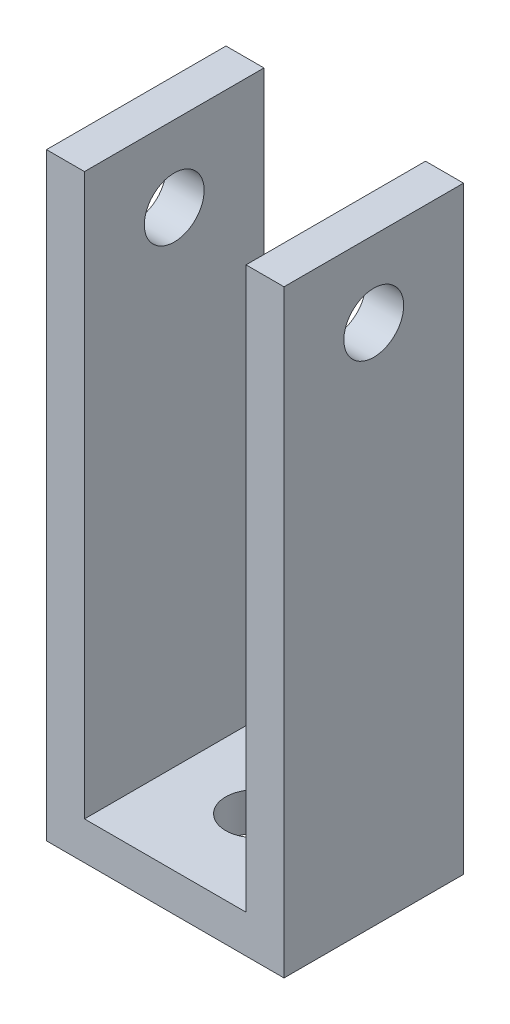
ISO-10303-21;
HEADER;
FILE_DESCRIPTION(('STEP AP214'),'2;1');
FILE_NAME('part.step','',(''),(''),'','','');
FILE_SCHEMA(('AUTOMOTIVE_DESIGN { 1 0 10303 214 1 1 1 1 }'));
ENDSEC;
DATA;
#1=APPLICATION_CONTEXT('core data for automotive mechanical design processes');
#2=APPLICATION_PROTOCOL_DEFINITION('international standard','automotive_design',2000,#1);
#3=PRODUCT_CONTEXT('',#1,'mechanical');
#4=PRODUCT('Part','Part','',(#3));
#5=PRODUCT_RELATED_PRODUCT_CATEGORY('part','',(#4));
#6=PRODUCT_DEFINITION_FORMATION('','',#4);
#7=PRODUCT_DEFINITION_CONTEXT('part definition',#1,'design');
#8=PRODUCT_DEFINITION('design','',#6,#7);
#9=PRODUCT_DEFINITION_SHAPE('','',#8);
#10=(LENGTH_UNIT() NAMED_UNIT(*) SI_UNIT(.MILLI.,.METRE.));
#11=(NAMED_UNIT(*) PLANE_ANGLE_UNIT() SI_UNIT($,.RADIAN.));
#12=(NAMED_UNIT(*) SI_UNIT($,.STERADIAN.) SOLID_ANGLE_UNIT());
#13=UNCERTAINTY_MEASURE_WITH_UNIT(LENGTH_MEASURE(1.E-05),#10,'distance_accuracy_value','');
#14=(GEOMETRIC_REPRESENTATION_CONTEXT(3) GLOBAL_UNCERTAINTY_ASSIGNED_CONTEXT((#13)) GLOBAL_UNIT_ASSIGNED_CONTEXT((#10,
#11,#12)) REPRESENTATION_CONTEXT('',''));
#15=CARTESIAN_POINT('',(0.,0.,0.));
#16=DIRECTION('',(0.,0.,1.));
#17=DIRECTION('',(1.,0.,0.));
#18=AXIS2_PLACEMENT_3D('',#15,#16,#17);
#19=CARTESIAN_POINT('',(0.,-81.,15.));
#20=DIRECTION('',(0.,-1.,0.));
#21=DIRECTION('',(0.,0.,-1.));
#22=AXIS2_PLACEMENT_3D('',#19,#20,#21);
#23=PLANE('',#22);
#24=CARTESIAN_POINT('',(1.13259527701055E-13,-81.,0.));
#25=DIRECTION('',(0.,-1.,0.));
#26=DIRECTION('',(0.,0.,-1.));
#27=AXIS2_PLACEMENT_3D('',#24,#25,#26);
#28=CIRCLE('',#27,4.89999999999988);
#29=CARTESIAN_POINT('',(4.9,-81.,0.));
#30=VERTEX_POINT('',#29);
#31=EDGE_CURVE('E224',#30,#30,#28,.T.);
#32=ORIENTED_EDGE('',*,*,#31,.T.);
#33=EDGE_LOOP('',(#32));
#34=FACE_BOUND('',#33,.T.);
#35=DIRECTION('',(-1.,0.,0.));
#36=VECTOR('',#35,1.);
#37=CARTESIAN_POINT('',(0.,-81.,-15.));
#38=LINE('',#37,#36);
#39=CARTESIAN_POINT('',(13.5,-81.,-15.));
#40=VERTEX_POINT('',#39);
#41=CARTESIAN_POINT('',(-13.5,-81.,-15.));
#42=VERTEX_POINT('',#41);
#43=EDGE_CURVE('E143',#40,#42,#38,.T.);
#44=ORIENTED_EDGE('',*,*,#43,.T.);
#45=DIRECTION('',(0.,0.,-1.));
#46=VECTOR('',#45,1.);
#47=CARTESIAN_POINT('',(-13.5,-81.,15.));
#48=LINE('',#47,#46);
#49=CARTESIAN_POINT('',(-13.5,-81.,15.));
#50=VERTEX_POINT('',#49);
#51=EDGE_CURVE('E11',#50,#42,#48,.T.);
#52=ORIENTED_EDGE('',*,*,#51,.F.);
#53=DIRECTION('',(-1.,0.,0.));
#54=VECTOR('',#53,1.);
#55=CARTESIAN_POINT('',(0.,-81.,15.));
#56=LINE('',#55,#54);
#57=CARTESIAN_POINT('',(13.5,-81.,15.));
#58=VERTEX_POINT('',#57);
#59=EDGE_CURVE('E169',#58,#50,#56,.T.);
#60=ORIENTED_EDGE('',*,*,#59,.F.);
#61=DIRECTION('',(0.,0.,-1.));
#62=VECTOR('',#61,1.);
#63=CARTESIAN_POINT('',(13.5,-81.,15.));
#64=LINE('',#63,#62);
#65=EDGE_CURVE('E59',#58,#40,#64,.T.);
#66=ORIENTED_EDGE('',*,*,#65,.T.);
#67=EDGE_LOOP('',(#44,#52,#60,#66));
#68=FACE_BOUND('',#67,.T.);
#69=ADVANCED_FACE('F41',(#34,#68),#23,.F.);
#70=CARTESIAN_POINT('',(-13.5,0.,15.));
#71=DIRECTION('',(-1.,0.,0.));
#72=DIRECTION('',(0.,0.,1.));
#73=AXIS2_PLACEMENT_3D('',#70,#71,#72);
#74=PLANE('',#73);
#75=CARTESIAN_POINT('',(-13.5,0.,0.));
#76=DIRECTION('',(-1.,0.,0.));
#77=DIRECTION('',(0.,0.,1.));
#78=AXIS2_PLACEMENT_3D('',#75,#76,#77);
#79=CIRCLE('',#78,5.);
#80=CARTESIAN_POINT('',(-13.5,-5.,0.));
#81=VERTEX_POINT('',#80);
#82=EDGE_CURVE('E147',#81,#81,#79,.T.);
#83=ORIENTED_EDGE('',*,*,#82,.T.);
#84=EDGE_LOOP('',(#83));
#85=FACE_BOUND('',#84,.T.);
#86=DIRECTION('',(0.,1.,0.));
#87=VECTOR('',#86,1.);
#88=CARTESIAN_POINT('',(-13.5,0.,-15.));
#89=LINE('',#88,#87);
#90=CARTESIAN_POINT('',(-13.5,12.7,-15.));
#91=VERTEX_POINT('',#90);
#92=EDGE_CURVE('E146',#42,#91,#89,.T.);
#93=ORIENTED_EDGE('',*,*,#92,.T.);
#94=DIRECTION('',(0.,0.,-1.));
#95=VECTOR('',#94,1.);
#96=CARTESIAN_POINT('',(-13.5,12.7,15.));
#97=LINE('',#96,#95);
#98=CARTESIAN_POINT('',(-13.5,12.7,15.));
#99=VERTEX_POINT('',#98);
#100=EDGE_CURVE('E51',#99,#91,#97,.T.);
#101=ORIENTED_EDGE('',*,*,#100,.F.);
#102=DIRECTION('',(0.,1.,0.));
#103=VECTOR('',#102,1.);
#104=CARTESIAN_POINT('',(-13.5,0.,15.));
#105=LINE('',#104,#103);
#106=EDGE_CURVE('E97',#50,#99,#105,.T.);
#107=ORIENTED_EDGE('',*,*,#106,.F.);
#108=ORIENTED_EDGE('',*,*,#51,.T.);
#109=EDGE_LOOP('',(#93,#101,#107,#108));
#110=FACE_BOUND('',#109,.T.);
#111=ADVANCED_FACE('F247',(#85,#110),#74,.F.);
#112=CARTESIAN_POINT('',(0.,12.7,15.));
#113=DIRECTION('',(0.,-1.,0.));
#114=DIRECTION('',(0.,0.,-1.));
#115=AXIS2_PLACEMENT_3D('',#112,#113,#114);
#116=PLANE('',#115);
#117=DIRECTION('',(-1.,0.,0.));
#118=VECTOR('',#117,1.);
#119=CARTESIAN_POINT('',(0.,12.7,-15.));
#120=LINE('',#119,#118);
#121=CARTESIAN_POINT('',(-19.85,12.7,-15.));
#122=VERTEX_POINT('',#121);
#123=EDGE_CURVE('E150',#91,#122,#120,.T.);
#124=ORIENTED_EDGE('',*,*,#123,.T.);
#125=DIRECTION('',(0.,0.,-1.));
#126=VECTOR('',#125,1.);
#127=CARTESIAN_POINT('',(-19.85,12.7,15.));
#128=LINE('',#127,#126);
#129=CARTESIAN_POINT('',(-19.85,12.7,15.));
#130=VERTEX_POINT('',#129);
#131=EDGE_CURVE('E180',#130,#122,#128,.T.);
#132=ORIENTED_EDGE('',*,*,#131,.F.);
#133=DIRECTION('',(-1.,0.,0.));
#134=VECTOR('',#133,1.);
#135=CARTESIAN_POINT('',(0.,12.7,15.));
#136=LINE('',#135,#134);
#137=EDGE_CURVE('E191',#99,#130,#136,.T.);
#138=ORIENTED_EDGE('',*,*,#137,.F.);
#139=ORIENTED_EDGE('',*,*,#100,.T.);
#140=EDGE_LOOP('',(#124,#132,#138,#139));
#141=FACE_BOUND('',#140,.T.);
#142=ADVANCED_FACE('F189',(#141),#116,.F.);
#143=CARTESIAN_POINT('',(-19.85,0.,15.));
#144=DIRECTION('',(1.,0.,0.));
#145=DIRECTION('',(0.,1.,0.));
#146=AXIS2_PLACEMENT_3D('',#143,#144,#145);
#147=PLANE('',#146);
#148=CARTESIAN_POINT('',(-19.85,0.,0.));
#149=DIRECTION('',(-1.,0.,0.));
#150=DIRECTION('',(0.,-1.,0.));
#151=AXIS2_PLACEMENT_3D('',#148,#149,#150);
#152=CIRCLE('',#151,5.);
#153=CARTESIAN_POINT('',(-19.85,-5.,0.));
#154=VERTEX_POINT('',#153);
#155=EDGE_CURVE('E220',#154,#154,#152,.T.);
#156=ORIENTED_EDGE('',*,*,#155,.F.);
#157=EDGE_LOOP('',(#156));
#158=FACE_BOUND('',#157,.T.);
#159=DIRECTION('',(0.,-1.,0.));
#160=VECTOR('',#159,1.);
#161=CARTESIAN_POINT('',(-19.85,0.,-15.));
#162=LINE('',#161,#160);
#163=CARTESIAN_POINT('',(-19.85,-87.35,-15.));
#164=VERTEX_POINT('',#163);
#165=EDGE_CURVE('E153',#122,#164,#162,.T.);
#166=ORIENTED_EDGE('',*,*,#165,.T.);
#167=DIRECTION('',(0.,0.,-1.));
#168=VECTOR('',#167,1.);
#169=CARTESIAN_POINT('',(-19.85,-87.35,15.));
#170=LINE('',#169,#168);
#171=CARTESIAN_POINT('',(-19.85,-87.35,15.));
#172=VERTEX_POINT('',#171);
#173=EDGE_CURVE('E176',#172,#164,#170,.T.);
#174=ORIENTED_EDGE('',*,*,#173,.F.);
#175=DIRECTION('',(0.,-1.,0.));
#176=VECTOR('',#175,1.);
#177=CARTESIAN_POINT('',(-19.85,0.,15.));
#178=LINE('',#177,#176);
#179=EDGE_CURVE('E203',#130,#172,#178,.T.);
#180=ORIENTED_EDGE('',*,*,#179,.F.);
#181=ORIENTED_EDGE('',*,*,#131,.T.);
#182=EDGE_LOOP('',(#166,#174,#180,#181));
#183=FACE_BOUND('',#182,.T.);
#184=ADVANCED_FACE('F198',(#158,#183),#147,.F.);
#185=CARTESIAN_POINT('',(0.,-87.35,15.));
#186=DIRECTION('',(0.,1.,0.));
#187=DIRECTION('',(0.,0.,1.));
#188=AXIS2_PLACEMENT_3D('',#185,#186,#187);
#189=PLANE('',#188);
#190=CARTESIAN_POINT('',(1.22138515366508E-13,-87.35,0.));
#191=DIRECTION('',(0.,-1.,0.));
#192=DIRECTION('',(1.,0.,0.));
#193=AXIS2_PLACEMENT_3D('',#190,#191,#192);
#194=CIRCLE('',#193,4.89999999999988);
#195=CARTESIAN_POINT('',(4.90000000000001,-87.35,0.));
#196=VERTEX_POINT('',#195);
#197=EDGE_CURVE('E228',#196,#196,#194,.T.);
#198=ORIENTED_EDGE('',*,*,#197,.F.);
#199=EDGE_LOOP('',(#198));
#200=FACE_BOUND('',#199,.T.);
#201=DIRECTION('',(1.,0.,0.));
#202=VECTOR('',#201,1.);
#203=CARTESIAN_POINT('',(0.,-87.35,-15.));
#204=LINE('',#203,#202);
#205=CARTESIAN_POINT('',(19.85,-87.35,-15.));
#206=VERTEX_POINT('',#205);
#207=EDGE_CURVE('E156',#164,#206,#204,.T.);
#208=ORIENTED_EDGE('',*,*,#207,.T.);
#209=DIRECTION('',(0.,0.,-1.));
#210=VECTOR('',#209,1.);
#211=CARTESIAN_POINT('',(19.85,-87.35,15.));
#212=LINE('',#211,#210);
#213=CARTESIAN_POINT('',(19.85,-87.35,15.));
#214=VERTEX_POINT('',#213);
#215=EDGE_CURVE('E123',#214,#206,#212,.T.);
#216=ORIENTED_EDGE('',*,*,#215,.F.);
#217=DIRECTION('',(1.,0.,0.));
#218=VECTOR('',#217,1.);
#219=CARTESIAN_POINT('',(0.,-87.35,15.));
#220=LINE('',#219,#218);
#221=EDGE_CURVE('E131',#172,#214,#220,.T.);
#222=ORIENTED_EDGE('',*,*,#221,.F.);
#223=ORIENTED_EDGE('',*,*,#173,.T.);
#224=EDGE_LOOP('',(#208,#216,#222,#223));
#225=FACE_BOUND('',#224,.T.);
#226=ADVANCED_FACE('F201',(#200,#225),#189,.F.);
#227=CARTESIAN_POINT('',(19.85,0.,15.));
#228=DIRECTION('',(1.,0.,0.));
#229=DIRECTION('',(0.,1.,0.));
#230=AXIS2_PLACEMENT_3D('',#227,#228,#229);
#231=PLANE('',#230);
#232=CARTESIAN_POINT('',(19.85,0.,0.));
#233=DIRECTION('',(1.,0.,0.));
#234=DIRECTION('',(0.,1.,0.));
#235=AXIS2_PLACEMENT_3D('',#232,#233,#234);
#236=CIRCLE('',#235,5.);
#237=CARTESIAN_POINT('',(19.85,-5.,0.));
#238=VERTEX_POINT('',#237);
#239=EDGE_CURVE('E216',#238,#238,#236,.T.);
#240=ORIENTED_EDGE('',*,*,#239,.F.);
#241=EDGE_LOOP('',(#240));
#242=FACE_BOUND('',#241,.T.);
#243=DIRECTION('',(0.,-1.,0.));
#244=VECTOR('',#243,1.);
#245=CARTESIAN_POINT('',(19.85,0.,-15.));
#246=LINE('',#245,#244);
#247=CARTESIAN_POINT('',(19.85,12.7,-15.));
#248=VERTEX_POINT('',#247);
#249=EDGE_CURVE('E118',#248,#206,#246,.T.);
#250=ORIENTED_EDGE('',*,*,#249,.F.);
#251=DIRECTION('',(0.,0.,-1.));
#252=VECTOR('',#251,1.);
#253=CARTESIAN_POINT('',(19.85,12.7,15.));
#254=LINE('',#253,#252);
#255=CARTESIAN_POINT('',(19.85,12.7,15.));
#256=VERTEX_POINT('',#255);
#257=EDGE_CURVE('E113',#256,#248,#254,.T.);
#258=ORIENTED_EDGE('',*,*,#257,.F.);
#259=DIRECTION('',(0.,-1.,0.));
#260=VECTOR('',#259,1.);
#261=CARTESIAN_POINT('',(19.85,0.,15.));
#262=LINE('',#261,#260);
#263=EDGE_CURVE('E116',#256,#214,#262,.T.);
#264=ORIENTED_EDGE('',*,*,#263,.T.);
#265=ORIENTED_EDGE('',*,*,#215,.T.);
#266=EDGE_LOOP('',(#250,#258,#264,#265));
#267=FACE_BOUND('',#266,.T.);
#268=ADVANCED_FACE('F115',(#242,#267),#231,.T.);
#269=CARTESIAN_POINT('',(0.,12.7,15.));
#270=DIRECTION('',(0.,1.,0.));
#271=DIRECTION('',(0.,0.,1.));
#272=AXIS2_PLACEMENT_3D('',#269,#270,#271);
#273=PLANE('',#272);
#274=DIRECTION('',(1.,0.,0.));
#275=VECTOR('',#274,1.);
#276=CARTESIAN_POINT('',(0.,12.7,-15.));
#277=LINE('',#276,#275);
#278=CARTESIAN_POINT('',(13.5,12.7,-15.));
#279=VERTEX_POINT('',#278);
#280=EDGE_CURVE('E162',#279,#248,#277,.T.);
#281=ORIENTED_EDGE('',*,*,#280,.F.);
#282=DIRECTION('',(0.,0.,-1.));
#283=VECTOR('',#282,1.);
#284=CARTESIAN_POINT('',(13.5,12.7,15.));
#285=LINE('',#284,#283);
#286=CARTESIAN_POINT('',(13.5,12.7,15.));
#287=VERTEX_POINT('',#286);
#288=EDGE_CURVE('E85',#287,#279,#285,.T.);
#289=ORIENTED_EDGE('',*,*,#288,.F.);
#290=DIRECTION('',(1.,0.,0.));
#291=VECTOR('',#290,1.);
#292=CARTESIAN_POINT('',(0.,12.7,15.));
#293=LINE('',#292,#291);
#294=EDGE_CURVE('E129',#287,#256,#293,.T.);
#295=ORIENTED_EDGE('',*,*,#294,.T.);
#296=ORIENTED_EDGE('',*,*,#257,.T.);
#297=EDGE_LOOP('',(#281,#289,#295,#296));
#298=FACE_BOUND('',#297,.T.);
#299=ADVANCED_FACE('F135',(#298),#273,.T.);
#300=CARTESIAN_POINT('',(13.5,0.,15.));
#301=DIRECTION('',(-1.,0.,0.));
#302=DIRECTION('',(0.,-1.,0.));
#303=AXIS2_PLACEMENT_3D('',#300,#301,#302);
#304=PLANE('',#303);
#305=CARTESIAN_POINT('',(13.5,0.,0.));
#306=DIRECTION('',(-1.,0.,0.));
#307=DIRECTION('',(0.,-1.,0.));
#308=AXIS2_PLACEMENT_3D('',#305,#306,#307);
#309=CIRCLE('',#308,5.);
#310=CARTESIAN_POINT('',(13.5,-5.,0.));
#311=VERTEX_POINT('',#310);
#312=EDGE_CURVE('E44',#311,#311,#309,.T.);
#313=ORIENTED_EDGE('',*,*,#312,.F.);
#314=EDGE_LOOP('',(#313));
#315=FACE_BOUND('',#314,.T.);
#316=DIRECTION('',(0.,1.,0.));
#317=VECTOR('',#316,1.);
#318=CARTESIAN_POINT('',(13.5,0.,-15.));
#319=LINE('',#318,#317);
#320=EDGE_CURVE('E165',#40,#279,#319,.T.);
#321=ORIENTED_EDGE('',*,*,#320,.F.);
#322=ORIENTED_EDGE('',*,*,#65,.F.);
#323=DIRECTION('',(0.,1.,0.));
#324=VECTOR('',#323,1.);
#325=CARTESIAN_POINT('',(13.5,0.,15.));
#326=LINE('',#325,#324);
#327=EDGE_CURVE('E137',#58,#287,#326,.T.);
#328=ORIENTED_EDGE('',*,*,#327,.T.);
#329=ORIENTED_EDGE('',*,*,#288,.T.);
#330=EDGE_LOOP('',(#321,#322,#328,#329));
#331=FACE_BOUND('',#330,.T.);
#332=ADVANCED_FACE('F255',(#315,#331),#304,.T.);
#333=CARTESIAN_POINT('',(0.,0.,15.));
#334=DIRECTION('',(0.,0.,1.));
#335=DIRECTION('',(1.,0.,0.));
#336=AXIS2_PLACEMENT_3D('',#333,#334,#335);
#337=PLANE('',#336);
#338=ORIENTED_EDGE('',*,*,#59,.T.);
#339=ORIENTED_EDGE('',*,*,#106,.T.);
#340=ORIENTED_EDGE('',*,*,#137,.T.);
#341=ORIENTED_EDGE('',*,*,#179,.T.);
#342=ORIENTED_EDGE('',*,*,#221,.T.);
#343=ORIENTED_EDGE('',*,*,#263,.F.);
#344=ORIENTED_EDGE('',*,*,#294,.F.);
#345=ORIENTED_EDGE('',*,*,#327,.F.);
#346=EDGE_LOOP('',(#338,#339,#340,#341,#342,#343,#344,#345));
#347=FACE_BOUND('',#346,.T.);
#348=ADVANCED_FACE('F127',(#347),#337,.T.);
#349=CARTESIAN_POINT('',(0.,0.,-15.));
#350=DIRECTION('',(0.,0.,1.));
#351=DIRECTION('',(1.,0.,0.));
#352=AXIS2_PLACEMENT_3D('',#349,#350,#351);
#353=PLANE('',#352);
#354=ORIENTED_EDGE('',*,*,#43,.F.);
#355=ORIENTED_EDGE('',*,*,#320,.T.);
#356=ORIENTED_EDGE('',*,*,#280,.T.);
#357=ORIENTED_EDGE('',*,*,#249,.T.);
#358=ORIENTED_EDGE('',*,*,#207,.F.);
#359=ORIENTED_EDGE('',*,*,#165,.F.);
#360=ORIENTED_EDGE('',*,*,#123,.F.);
#361=ORIENTED_EDGE('',*,*,#92,.F.);
#362=EDGE_LOOP('',(#354,#355,#356,#357,#358,#359,#360,#361));
#363=FACE_BOUND('',#362,.T.);
#364=ADVANCED_FACE('F194',(#363),#353,.F.);
#365=CARTESIAN_POINT('',(40.15,0.,0.));
#366=DIRECTION('',(-1.,0.,0.));
#367=DIRECTION('',(0.,-1.,0.));
#368=AXIS2_PLACEMENT_3D('',#365,#366,#367);
#369=CYLINDRICAL_SURFACE('',#368,5.);
#370=CARTESIAN_POINT('',(19.85,-5.,0.));
#371=CARTESIAN_POINT('',(19.7838541666667,-5.,0.));
#372=CARTESIAN_POINT('',(19.7177083333333,-5.,0.));
#373=CARTESIAN_POINT('',(19.5854166666667,-5.,0.));
#374=CARTESIAN_POINT('',(19.5192708333333,-5.,0.));
#375=CARTESIAN_POINT('',(19.3869791666667,-5.,0.));
#376=CARTESIAN_POINT('',(19.3208333333333,-5.,0.));
#377=CARTESIAN_POINT('',(19.1885416666667,-5.,0.));
#378=CARTESIAN_POINT('',(19.1223958333333,-5.,0.));
#379=CARTESIAN_POINT('',(18.9901041666667,-5.,0.));
#380=CARTESIAN_POINT('',(18.9239583333333,-5.,0.));
#381=CARTESIAN_POINT('',(18.7916666666667,-5.,0.));
#382=CARTESIAN_POINT('',(18.7255208333333,-5.,0.));
#383=CARTESIAN_POINT('',(18.5932291666667,-5.,0.));
#384=CARTESIAN_POINT('',(18.5270833333333,-5.,0.));
#385=CARTESIAN_POINT('',(18.3947916666667,-5.,0.));
#386=CARTESIAN_POINT('',(18.3286458333333,-5.,0.));
#387=CARTESIAN_POINT('',(18.1963541666667,-5.,0.));
#388=CARTESIAN_POINT('',(18.1302083333333,-5.,0.));
#389=CARTESIAN_POINT('',(17.9979166666667,-5.,0.));
#390=CARTESIAN_POINT('',(17.9317708333333,-5.,0.));
#391=CARTESIAN_POINT('',(17.7994791666667,-5.,0.));
#392=CARTESIAN_POINT('',(17.7333333333333,-5.,0.));
#393=CARTESIAN_POINT('',(17.6010416666667,-5.,0.));
#394=CARTESIAN_POINT('',(17.5348958333333,-5.,0.));
#395=CARTESIAN_POINT('',(17.4026041666667,-5.,0.));
#396=CARTESIAN_POINT('',(17.3364583333333,-5.,0.));
#397=CARTESIAN_POINT('',(17.2041666666667,-5.,0.));
#398=CARTESIAN_POINT('',(17.1380208333333,-5.,0.));
#399=CARTESIAN_POINT('',(17.0057291666667,-5.,0.));
#400=CARTESIAN_POINT('',(16.9395833333333,-5.,0.));
#401=CARTESIAN_POINT('',(16.8072916666667,-5.,0.));
#402=CARTESIAN_POINT('',(16.7411458333333,-5.,0.));
#403=CARTESIAN_POINT('',(16.6088541666667,-5.,0.));
#404=CARTESIAN_POINT('',(16.5427083333333,-5.,0.));
#405=CARTESIAN_POINT('',(16.4104166666667,-5.,0.));
#406=CARTESIAN_POINT('',(16.3442708333333,-5.,0.));
#407=CARTESIAN_POINT('',(16.2119791666667,-5.,0.));
#408=CARTESIAN_POINT('',(16.1458333333333,-5.,0.));
#409=CARTESIAN_POINT('',(16.0135416666667,-5.,0.));
#410=CARTESIAN_POINT('',(15.9473958333333,-5.,0.));
#411=CARTESIAN_POINT('',(15.8151041666667,-5.,0.));
#412=CARTESIAN_POINT('',(15.7489583333333,-5.,0.));
#413=CARTESIAN_POINT('',(15.6166666666667,-5.,0.));
#414=CARTESIAN_POINT('',(15.5505208333333,-5.,0.));
#415=CARTESIAN_POINT('',(15.4182291666667,-5.,0.));
#416=CARTESIAN_POINT('',(15.3520833333333,-5.,0.));
#417=CARTESIAN_POINT('',(15.2197916666667,-5.,0.));
#418=CARTESIAN_POINT('',(15.1536458333333,-5.,0.));
#419=CARTESIAN_POINT('',(15.0213541666667,-5.,0.));
#420=CARTESIAN_POINT('',(14.9552083333333,-5.,0.));
#421=CARTESIAN_POINT('',(14.8229166666667,-5.,0.));
#422=CARTESIAN_POINT('',(14.7567708333333,-5.,0.));
#423=CARTESIAN_POINT('',(14.6244791666667,-5.,0.));
#424=CARTESIAN_POINT('',(14.5583333333333,-5.,0.));
#425=CARTESIAN_POINT('',(14.4260416666667,-5.,0.));
#426=CARTESIAN_POINT('',(14.3598958333333,-5.,0.));
#427=CARTESIAN_POINT('',(14.2276041666667,-5.,0.));
#428=CARTESIAN_POINT('',(14.1614583333333,-5.,0.));
#429=CARTESIAN_POINT('',(14.0291666666667,-5.,0.));
#430=CARTESIAN_POINT('',(13.9630208333333,-5.,0.));
#431=CARTESIAN_POINT('',(13.8307291666667,-5.,0.));
#432=CARTESIAN_POINT('',(13.7645833333333,-5.,0.));
#433=CARTESIAN_POINT('',(13.6322916666667,-5.,0.));
#434=CARTESIAN_POINT('',(13.5661458333333,-5.,0.));
#435=CARTESIAN_POINT('',(13.5,-5.,0.));
#436=B_SPLINE_CURVE_WITH_KNOTS('',3,(#370,#371,#372,#373,#374,#375,#376,#377,#378,#379,#380,
#381,#382,#383,#384,#385,#386,#387,#388,#389,#390,#391,#392,#393,#394,#395,#396,#397,#398,#399,
#400,#401,#402,#403,#404,#405,#406,#407,#408,#409,#410,#411,#412,#413,#414,#415,#416,#417,#418,
#419,#420,#421,#422,#423,#424,#425,#426,#427,#428,#429,#430,#431,#432,#433,#434,#435),
.UNSPECIFIED.,.F.,.F.,(4,2,2,2,2,2,2,2,2,2,2,2,2,2,2,2,2,2,2,2,2,2,2,2,2,2,2,2,2,2,2,2,4),(0.,
0.198437499999999,0.396874999999998,0.5953125,0.793749999999999,0.992187499999998,1.190625,
1.3890625,1.5875,1.7859375,1.984375,2.1828125,2.38125,2.5796875,2.778125,2.9765625,3.175,
3.3734375,3.571875,3.7703125,3.96875,4.1671875,4.365625,4.5640625,4.7625,4.96093749999999,
5.15937499999999,5.3578125,5.55625,5.75468749999999,5.953125,6.1515625,6.34999999999999),.UNSPECIFIED.);
#437=EDGE_CURVE('BSEAM268',#238,#311,#436,.T.);
#438=ORIENTED_EDGE('',*,*,#239,.T.);
#439=ORIENTED_EDGE('',*,*,#312,.T.);
#440=ORIENTED_EDGE('',*,*,#437,.T.);
#441=ORIENTED_EDGE('',*,*,#437,.F.);
#442=EDGE_LOOP('',(#438,#440,#439,#441));
#443=FACE_BOUND('',#442,.T.);
#444=ADVANCED_FACE('F268',(#443),#369,.F.);
#445=CARTESIAN_POINT('',(-19.85,-5.,0.));
#446=CARTESIAN_POINT('',(-19.7838541666667,-5.,0.));
#447=CARTESIAN_POINT('',(-19.7177083333333,-5.,0.));
#448=CARTESIAN_POINT('',(-19.5854166666667,-5.,0.));
#449=CARTESIAN_POINT('',(-19.5192708333333,-5.,0.));
#450=CARTESIAN_POINT('',(-19.3869791666667,-5.,0.));
#451=CARTESIAN_POINT('',(-19.3208333333333,-5.,0.));
#452=CARTESIAN_POINT('',(-19.1885416666667,-5.,0.));
#453=CARTESIAN_POINT('',(-19.1223958333333,-5.,0.));
#454=CARTESIAN_POINT('',(-18.9901041666667,-5.,0.));
#455=CARTESIAN_POINT('',(-18.9239583333333,-5.,0.));
#456=CARTESIAN_POINT('',(-18.7916666666667,-5.,0.));
#457=CARTESIAN_POINT('',(-18.7255208333333,-5.,0.));
#458=CARTESIAN_POINT('',(-18.5932291666667,-5.,0.));
#459=CARTESIAN_POINT('',(-18.5270833333333,-5.,0.));
#460=CARTESIAN_POINT('',(-18.3947916666667,-5.,0.));
#461=CARTESIAN_POINT('',(-18.3286458333333,-5.,0.));
#462=CARTESIAN_POINT('',(-18.1963541666667,-5.,0.));
#463=CARTESIAN_POINT('',(-18.1302083333333,-5.,0.));
#464=CARTESIAN_POINT('',(-17.9979166666667,-5.,0.));
#465=CARTESIAN_POINT('',(-17.9317708333333,-5.,0.));
#466=CARTESIAN_POINT('',(-17.7994791666667,-5.,0.));
#467=CARTESIAN_POINT('',(-17.7333333333333,-5.,0.));
#468=CARTESIAN_POINT('',(-17.6010416666667,-5.,0.));
#469=CARTESIAN_POINT('',(-17.5348958333333,-5.,0.));
#470=CARTESIAN_POINT('',(-17.4026041666667,-5.,0.));
#471=CARTESIAN_POINT('',(-17.3364583333333,-5.,0.));
#472=CARTESIAN_POINT('',(-17.2041666666667,-5.,0.));
#473=CARTESIAN_POINT('',(-17.1380208333333,-5.,0.));
#474=CARTESIAN_POINT('',(-17.0057291666667,-5.,0.));
#475=CARTESIAN_POINT('',(-16.9395833333333,-5.,0.));
#476=CARTESIAN_POINT('',(-16.8072916666667,-5.,0.));
#477=CARTESIAN_POINT('',(-16.7411458333333,-5.,0.));
#478=CARTESIAN_POINT('',(-16.6088541666667,-5.,0.));
#479=CARTESIAN_POINT('',(-16.5427083333333,-5.,0.));
#480=CARTESIAN_POINT('',(-16.4104166666667,-5.,0.));
#481=CARTESIAN_POINT('',(-16.3442708333333,-5.,0.));
#482=CARTESIAN_POINT('',(-16.2119791666667,-5.,0.));
#483=CARTESIAN_POINT('',(-16.1458333333333,-5.,0.));
#484=CARTESIAN_POINT('',(-16.0135416666667,-5.,0.));
#485=CARTESIAN_POINT('',(-15.9473958333333,-5.,0.));
#486=CARTESIAN_POINT('',(-15.8151041666667,-5.,0.));
#487=CARTESIAN_POINT('',(-15.7489583333333,-5.,0.));
#488=CARTESIAN_POINT('',(-15.6166666666667,-5.,0.));
#489=CARTESIAN_POINT('',(-15.5505208333333,-5.,0.));
#490=CARTESIAN_POINT('',(-15.4182291666667,-5.,0.));
#491=CARTESIAN_POINT('',(-15.3520833333333,-5.,0.));
#492=CARTESIAN_POINT('',(-15.2197916666667,-5.,0.));
#493=CARTESIAN_POINT('',(-15.1536458333333,-5.,0.));
#494=CARTESIAN_POINT('',(-15.0213541666667,-5.,0.));
#495=CARTESIAN_POINT('',(-14.9552083333333,-5.,0.));
#496=CARTESIAN_POINT('',(-14.8229166666667,-5.,0.));
#497=CARTESIAN_POINT('',(-14.7567708333333,-5.,0.));
#498=CARTESIAN_POINT('',(-14.6244791666667,-5.,0.));
#499=CARTESIAN_POINT('',(-14.5583333333333,-5.,0.));
#500=CARTESIAN_POINT('',(-14.4260416666667,-5.,0.));
#501=CARTESIAN_POINT('',(-14.3598958333333,-5.,0.));
#502=CARTESIAN_POINT('',(-14.2276041666667,-5.,0.));
#503=CARTESIAN_POINT('',(-14.1614583333333,-5.,0.));
#504=CARTESIAN_POINT('',(-14.0291666666667,-5.,0.));
#505=CARTESIAN_POINT('',(-13.9630208333333,-5.,0.));
#506=CARTESIAN_POINT('',(-13.8307291666667,-5.,0.));
#507=CARTESIAN_POINT('',(-13.7645833333333,-5.,0.));
#508=CARTESIAN_POINT('',(-13.6322916666667,-5.,0.));
#509=CARTESIAN_POINT('',(-13.5661458333333,-5.,0.));
#510=CARTESIAN_POINT('',(-13.5,-5.,0.));
#511=B_SPLINE_CURVE_WITH_KNOTS('',3,(#445,#446,#447,#448,#449,#450,#451,#452,#453,#454,#455,
#456,#457,#458,#459,#460,#461,#462,#463,#464,#465,#466,#467,#468,#469,#470,#471,#472,#473,#474,
#475,#476,#477,#478,#479,#480,#481,#482,#483,#484,#485,#486,#487,#488,#489,#490,#491,#492,#493,
#494,#495,#496,#497,#498,#499,#500,#501,#502,#503,#504,#505,#506,#507,#508,#509,#510),
.UNSPECIFIED.,.F.,.F.,(4,2,2,2,2,2,2,2,2,2,2,2,2,2,2,2,2,2,2,2,2,2,2,2,2,2,2,2,2,2,2,2,4),(0.,
0.198437500000002,0.396874999999998,0.5953125,0.793750000000003,0.992187499999998,1.190625,
1.3890625,1.58750000000001,1.7859375,1.984375,2.18281250000001,2.38125,2.5796875,
2.77812500000001,2.9765625,3.175,3.37343750000001,3.571875,3.7703125,3.96875000000001,4.1671875,
4.365625,4.56406250000001,4.7625,4.96093750000001,5.15937500000001,5.3578125,5.55625000000001,
5.75468750000001,5.95312500000001,6.15156250000001,6.35000000000001),.UNSPECIFIED.);
#512=EDGE_CURVE('BSEAM272',#154,#81,#511,.T.);
#513=ORIENTED_EDGE('',*,*,#155,.T.);
#514=ORIENTED_EDGE('',*,*,#82,.F.);
#515=ORIENTED_EDGE('',*,*,#512,.T.);
#516=ORIENTED_EDGE('',*,*,#512,.F.);
#517=EDGE_LOOP('',(#513,#515,#514,#516));
#518=FACE_BOUND('',#517,.T.);
#519=ADVANCED_FACE('F272',(#518),#369,.F.);
#520=CARTESIAN_POINT('',(0.,-27.35,0.));
#521=DIRECTION('',(0.,-1.,0.));
#522=DIRECTION('',(1.,0.,0.));
#523=AXIS2_PLACEMENT_3D('',#520,#521,#522);
#524=CYLINDRICAL_SURFACE('',#523,4.89999999999988);
#525=CARTESIAN_POINT('',(4.90000000000001,-87.35,0.));
#526=CARTESIAN_POINT('',(4.90000000000001,-87.2838541666667,0.));
#527=CARTESIAN_POINT('',(4.90000000000001,-87.2177083333333,0.));
#528=CARTESIAN_POINT('',(4.90000000000001,-87.0854166666667,0.));
#529=CARTESIAN_POINT('',(4.90000000000001,-87.0192708333333,0.));
#530=CARTESIAN_POINT('',(4.90000000000001,-86.8869791666667,0.));
#531=CARTESIAN_POINT('',(4.90000000000001,-86.8208333333334,0.));
#532=CARTESIAN_POINT('',(4.90000000000001,-86.6885416666667,0.));
#533=CARTESIAN_POINT('',(4.9,-86.6223958333333,0.));
#534=CARTESIAN_POINT('',(4.9,-86.4901041666667,0.));
#535=CARTESIAN_POINT('',(4.9,-86.4239583333333,0.));
#536=CARTESIAN_POINT('',(4.9,-86.2916666666667,0.));
#537=CARTESIAN_POINT('',(4.9,-86.2255208333333,0.));
#538=CARTESIAN_POINT('',(4.9,-86.0932291666667,0.));
#539=CARTESIAN_POINT('',(4.9,-86.0270833333333,0.));
#540=CARTESIAN_POINT('',(4.9,-85.8947916666667,0.));
#541=CARTESIAN_POINT('',(4.9,-85.8286458333333,0.));
#542=CARTESIAN_POINT('',(4.9,-85.6963541666667,0.));
#543=CARTESIAN_POINT('',(4.9,-85.6302083333333,0.));
#544=CARTESIAN_POINT('',(4.9,-85.4979166666667,0.));
#545=CARTESIAN_POINT('',(4.9,-85.4317708333333,0.));
#546=CARTESIAN_POINT('',(4.9,-85.2994791666667,0.));
#547=CARTESIAN_POINT('',(4.9,-85.2333333333333,0.));
#548=CARTESIAN_POINT('',(4.9,-85.1010416666667,0.));
#549=CARTESIAN_POINT('',(4.9,-85.0348958333333,0.));
#550=CARTESIAN_POINT('',(4.9,-84.9026041666667,0.));
#551=CARTESIAN_POINT('',(4.9,-84.8364583333333,0.));
#552=CARTESIAN_POINT('',(4.9,-84.7041666666667,0.));
#553=CARTESIAN_POINT('',(4.9,-84.6380208333333,0.));
#554=CARTESIAN_POINT('',(4.9,-84.5057291666667,0.));
#555=CARTESIAN_POINT('',(4.9,-84.4395833333333,0.));
#556=CARTESIAN_POINT('',(4.9,-84.3072916666667,0.));
#557=CARTESIAN_POINT('',(4.9,-84.2411458333333,0.));
#558=CARTESIAN_POINT('',(4.9,-84.1088541666667,0.));
#559=CARTESIAN_POINT('',(4.9,-84.0427083333333,0.));
#560=CARTESIAN_POINT('',(4.9,-83.9104166666667,0.));
#561=CARTESIAN_POINT('',(4.9,-83.8442708333333,0.));
#562=CARTESIAN_POINT('',(4.9,-83.7119791666667,0.));
#563=CARTESIAN_POINT('',(4.9,-83.6458333333333,0.));
#564=CARTESIAN_POINT('',(4.9,-83.5135416666667,0.));
#565=CARTESIAN_POINT('',(4.9,-83.4473958333333,0.));
#566=CARTESIAN_POINT('',(4.9,-83.3151041666667,0.));
#567=CARTESIAN_POINT('',(4.9,-83.2489583333333,0.));
#568=CARTESIAN_POINT('',(4.9,-83.1166666666667,0.));
#569=CARTESIAN_POINT('',(4.9,-83.0505208333333,0.));
#570=CARTESIAN_POINT('',(4.9,-82.9182291666667,0.));
#571=CARTESIAN_POINT('',(4.9,-82.8520833333333,0.));
#572=CARTESIAN_POINT('',(4.9,-82.7197916666667,0.));
#573=CARTESIAN_POINT('',(4.9,-82.6536458333333,0.));
#574=CARTESIAN_POINT('',(4.9,-82.5213541666667,0.));
#575=CARTESIAN_POINT('',(4.9,-82.4552083333333,0.));
#576=CARTESIAN_POINT('',(4.9,-82.3229166666667,0.));
#577=CARTESIAN_POINT('',(4.9,-82.2567708333333,0.));
#578=CARTESIAN_POINT('',(4.9,-82.1244791666667,0.));
#579=CARTESIAN_POINT('',(4.9,-82.0583333333333,0.));
#580=CARTESIAN_POINT('',(4.9,-81.9260416666667,0.));
#581=CARTESIAN_POINT('',(4.9,-81.8598958333333,0.));
#582=CARTESIAN_POINT('',(4.9,-81.7276041666667,0.));
#583=CARTESIAN_POINT('',(4.9,-81.6614583333333,0.));
#584=CARTESIAN_POINT('',(4.9,-81.5291666666667,0.));
#585=CARTESIAN_POINT('',(4.9,-81.4630208333333,0.));
#586=CARTESIAN_POINT('',(4.9,-81.3307291666667,0.));
#587=CARTESIAN_POINT('',(4.9,-81.2645833333333,0.));
#588=CARTESIAN_POINT('',(4.9,-81.1322916666667,0.));
#589=CARTESIAN_POINT('',(4.9,-81.0661458333333,0.));
#590=CARTESIAN_POINT('',(4.9,-81.,0.));
#591=B_SPLINE_CURVE_WITH_KNOTS('',3,(#525,#526,#527,#528,#529,#530,#531,#532,#533,#534,#535,
#536,#537,#538,#539,#540,#541,#542,#543,#544,#545,#546,#547,#548,#549,#550,#551,#552,#553,#554,
#555,#556,#557,#558,#559,#560,#561,#562,#563,#564,#565,#566,#567,#568,#569,#570,#571,#572,#573,
#574,#575,#576,#577,#578,#579,#580,#581,#582,#583,#584,#585,#586,#587,#588,#589,#590),
.UNSPECIFIED.,.F.,.F.,(4,2,2,2,2,2,2,2,2,2,2,2,2,2,2,2,2,2,2,2,2,2,2,2,2,2,2,2,2,2,2,2,4),(0.,
0.198437500000009,0.396875000000005,0.5953125,0.79375000000001,0.992187500000005,1.190625,
1.38906250000001,1.58750000000002,1.7859375,1.98437500000001,2.18281250000002,2.38125,
2.57968750000001,2.77812500000002,2.9765625,3.17500000000001,3.37343750000002,3.571875,
3.77031250000001,3.96875000000002,4.1671875,4.36562500000001,4.56406250000002,4.7625,
4.96093750000001,5.15937500000002,5.3578125,5.55625000000001,5.75468750000002,5.95312500000002,
6.15156250000001,6.35000000000002),.UNSPECIFIED.);
#592=EDGE_CURVE('BSEAM233',#196,#30,#591,.T.);
#593=ORIENTED_EDGE('',*,*,#197,.T.);
#594=ORIENTED_EDGE('',*,*,#31,.F.);
#595=ORIENTED_EDGE('',*,*,#592,.T.);
#596=ORIENTED_EDGE('',*,*,#592,.F.);
#597=EDGE_LOOP('',(#593,#595,#594,#596));
#598=FACE_BOUND('',#597,.T.);
#599=ADVANCED_FACE('F233',(#598),#524,.F.);
#600=CLOSED_SHELL('',(#69,#111,#142,#184,#226,#268,#299,#332,#348,#364,#444,#519,#599));
#601=MANIFOLD_SOLID_BREP('B2',#600);
#602=ADVANCED_BREP_SHAPE_REPRESENTATION('',(#18,#601),#14);
#603=SHAPE_DEFINITION_REPRESENTATION(#9,#602);
ENDSEC;
END-ISO-10303-21;
